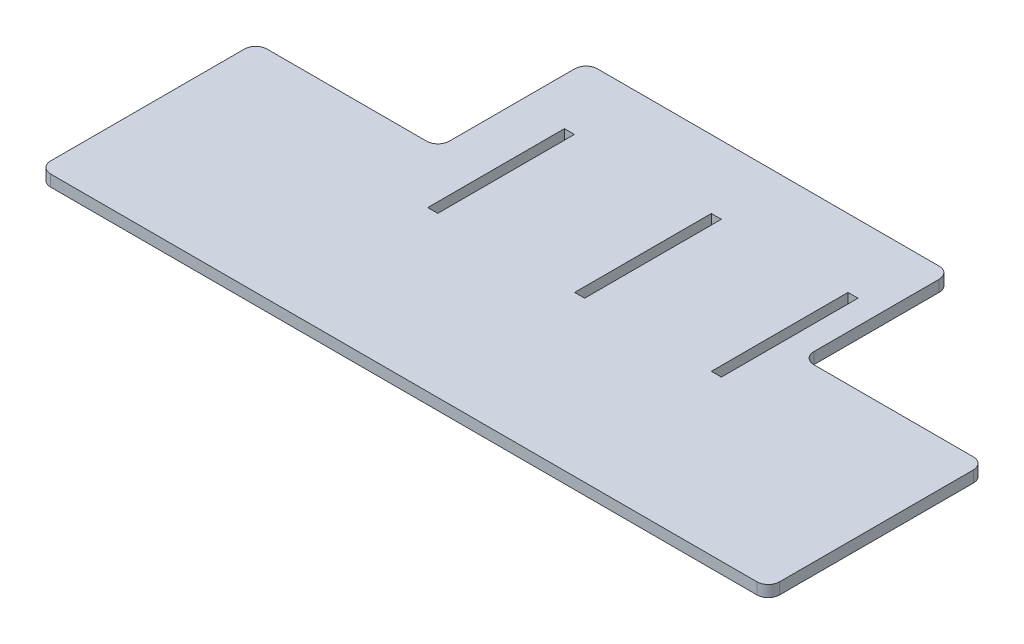
ISO-10303-21;
HEADER;
FILE_DESCRIPTION(('STEP AP214'),'2;1');
FILE_NAME('part.step','',(''),(''),'','','');
FILE_SCHEMA(('AUTOMOTIVE_DESIGN { 1 0 10303 214 1 1 1 1 }'));
ENDSEC;
DATA;
#1=APPLICATION_CONTEXT('core data for automotive mechanical design processes');
#2=APPLICATION_PROTOCOL_DEFINITION('international standard','automotive_design',2000,#1);
#3=PRODUCT_CONTEXT('',#1,'mechanical');
#4=PRODUCT('Part','Part','',(#3));
#5=PRODUCT_RELATED_PRODUCT_CATEGORY('part','',(#4));
#6=PRODUCT_DEFINITION_FORMATION('','',#4);
#7=PRODUCT_DEFINITION_CONTEXT('part definition',#1,'design');
#8=PRODUCT_DEFINITION('design','',#6,#7);
#9=PRODUCT_DEFINITION_SHAPE('','',#8);
#10=(LENGTH_UNIT() NAMED_UNIT(*) SI_UNIT(.MILLI.,.METRE.));
#11=(NAMED_UNIT(*) PLANE_ANGLE_UNIT() SI_UNIT($,.RADIAN.));
#12=(NAMED_UNIT(*) SI_UNIT($,.STERADIAN.) SOLID_ANGLE_UNIT());
#13=UNCERTAINTY_MEASURE_WITH_UNIT(LENGTH_MEASURE(1.E-05),#10,'distance_accuracy_value','');
#14=(GEOMETRIC_REPRESENTATION_CONTEXT(3) GLOBAL_UNCERTAINTY_ASSIGNED_CONTEXT((#13)) GLOBAL_UNIT_ASSIGNED_CONTEXT((#10,
#11,#12)) REPRESENTATION_CONTEXT('',''));
#15=CARTESIAN_POINT('',(0.,0.,0.));
#16=DIRECTION('',(0.,0.,1.));
#17=DIRECTION('',(1.,0.,0.));
#18=AXIS2_PLACEMENT_3D('',#15,#16,#17);
#19=CARTESIAN_POINT('',(101.6,3.175,30.1625));
#20=DIRECTION('',(-1.,0.,0.));
#21=DIRECTION('',(0.,0.,1.));
#22=AXIS2_PLACEMENT_3D('',#19,#20,#21);
#23=PLANE('',#22);
#24=DIRECTION('',(0.,0.,-1.));
#25=VECTOR('',#24,1.);
#26=CARTESIAN_POINT('',(101.6,3.175,30.1625));
#27=LINE('',#26,#25);
#28=CARTESIAN_POINT('',(101.6,3.175,26.9875));
#29=VERTEX_POINT('',#28);
#30=CARTESIAN_POINT('',(101.6,3.175,-26.9875));
#31=VERTEX_POINT('',#30);
#32=EDGE_CURVE('E306',#29,#31,#27,.T.);
#33=ORIENTED_EDGE('',*,*,#32,.F.);
#34=DIRECTION('',(0.,-1.,0.));
#35=VECTOR('',#34,1.);
#36=CARTESIAN_POINT('',(101.6,3.175,26.9875));
#37=LINE('',#36,#35);
#38=CARTESIAN_POINT('',(101.6,0.,26.9875));
#39=VERTEX_POINT('',#38);
#40=EDGE_CURVE('E404',#29,#39,#37,.T.);
#41=ORIENTED_EDGE('',*,*,#40,.T.);
#42=DIRECTION('',(0.,0.,-1.));
#43=VECTOR('',#42,1.);
#44=CARTESIAN_POINT('',(101.6,0.,30.1625));
#45=LINE('',#44,#43);
#46=CARTESIAN_POINT('',(101.6,0.,-26.9875));
#47=VERTEX_POINT('',#46);
#48=EDGE_CURVE('E299',#39,#47,#45,.T.);
#49=ORIENTED_EDGE('',*,*,#48,.T.);
#50=DIRECTION('',(0.,-1.,0.));
#51=VECTOR('',#50,1.);
#52=CARTESIAN_POINT('',(101.6,3.175,-26.9875));
#53=LINE('',#52,#51);
#54=EDGE_CURVE('E402',#47,#31,#53,.F.);
#55=ORIENTED_EDGE('',*,*,#54,.T.);
#56=EDGE_LOOP('',(#33,#41,#49,#55));
#57=FACE_BOUND('',#56,.T.);
#58=ADVANCED_FACE('F33',(#57),#23,.F.);
#59=CARTESIAN_POINT('',(50.8,3.175,-30.1625));
#60=DIRECTION('',(0.,0.,1.));
#61=DIRECTION('',(1.,0.,0.));
#62=AXIS2_PLACEMENT_3D('',#59,#60,#61);
#63=PLANE('',#62);
#64=DIRECTION('',(-1.,0.,0.));
#65=VECTOR('',#64,1.);
#66=CARTESIAN_POINT('',(50.8,3.175,-30.1625));
#67=LINE('',#66,#65);
#68=CARTESIAN_POINT('',(98.425,3.175,-30.1625));
#69=VERTEX_POINT('',#68);
#70=CARTESIAN_POINT('',(53.975,3.175,-30.1625));
#71=VERTEX_POINT('',#70);
#72=EDGE_CURVE('E309',#69,#71,#67,.T.);
#73=ORIENTED_EDGE('',*,*,#72,.F.);
#74=DIRECTION('',(0.,-1.,0.));
#75=VECTOR('',#74,1.);
#76=CARTESIAN_POINT('',(98.425,3.175,-30.1625));
#77=LINE('',#76,#75);
#78=CARTESIAN_POINT('',(98.425,0.,-30.1625));
#79=VERTEX_POINT('',#78);
#80=EDGE_CURVE('E409',#69,#79,#77,.T.);
#81=ORIENTED_EDGE('',*,*,#80,.T.);
#82=DIRECTION('',(-1.,0.,0.));
#83=VECTOR('',#82,1.);
#84=CARTESIAN_POINT('',(50.8,0.,-30.1625));
#85=LINE('',#84,#83);
#86=CARTESIAN_POINT('',(53.975,0.,-30.1625));
#87=VERTEX_POINT('',#86);
#88=EDGE_CURVE('E334',#79,#87,#85,.T.);
#89=ORIENTED_EDGE('',*,*,#88,.T.);
#90=DIRECTION('',(0.,-1.,0.));
#91=VECTOR('',#90,1.);
#92=CARTESIAN_POINT('',(53.975,3.175,-30.1625));
#93=LINE('',#92,#91);
#94=EDGE_CURVE('E407',#87,#71,#93,.F.);
#95=ORIENTED_EDGE('',*,*,#94,.T.);
#96=EDGE_LOOP('',(#73,#81,#89,#95));
#97=FACE_BOUND('',#96,.T.);
#98=ADVANCED_FACE('F517',(#97),#63,.F.);
#99=CARTESIAN_POINT('',(50.8,3.175,-30.1625));
#100=DIRECTION('',(-1.,0.,0.));
#101=DIRECTION('',(0.,0.,1.));
#102=AXIS2_PLACEMENT_3D('',#99,#100,#101);
#103=PLANE('',#102);
#104=DIRECTION('',(0.,0.,-1.));
#105=VECTOR('',#104,1.);
#106=CARTESIAN_POINT('',(50.8,3.175,-30.1625));
#107=LINE('',#106,#105);
#108=CARTESIAN_POINT('',(50.8,3.175,-33.3375));
#109=VERTEX_POINT('',#108);
#110=CARTESIAN_POINT('',(50.8,3.175,-68.2625));
#111=VERTEX_POINT('',#110);
#112=EDGE_CURVE('E313',#109,#111,#107,.T.);
#113=ORIENTED_EDGE('',*,*,#112,.F.);
#114=DIRECTION('',(0.,-1.,0.));
#115=VECTOR('',#114,1.);
#116=CARTESIAN_POINT('',(50.8,0.,-33.3375));
#117=LINE('',#116,#115);
#118=CARTESIAN_POINT('',(50.8,0.,-33.3375));
#119=VERTEX_POINT('',#118);
#120=EDGE_CURVE('E414',#109,#119,#117,.T.);
#121=ORIENTED_EDGE('',*,*,#120,.T.);
#122=DIRECTION('',(0.,0.,-1.));
#123=VECTOR('',#122,1.);
#124=CARTESIAN_POINT('',(50.8,0.,-30.1625));
#125=LINE('',#124,#123);
#126=CARTESIAN_POINT('',(50.8,0.,-68.2625));
#127=VERTEX_POINT('',#126);
#128=EDGE_CURVE('E337',#119,#127,#125,.T.);
#129=ORIENTED_EDGE('',*,*,#128,.T.);
#130=DIRECTION('',(0.,-1.,0.));
#131=VECTOR('',#130,1.);
#132=CARTESIAN_POINT('',(50.8,3.175,-68.2625));
#133=LINE('',#132,#131);
#134=EDGE_CURVE('E412',#127,#111,#133,.F.);
#135=ORIENTED_EDGE('',*,*,#134,.T.);
#136=EDGE_LOOP('',(#113,#121,#129,#135));
#137=FACE_BOUND('',#136,.T.);
#138=ADVANCED_FACE('F526',(#137),#103,.F.);
#139=CARTESIAN_POINT('',(-50.8,3.175,-71.4375));
#140=DIRECTION('',(0.,0.,1.));
#141=DIRECTION('',(1.,0.,0.));
#142=AXIS2_PLACEMENT_3D('',#139,#140,#141);
#143=PLANE('',#142);
#144=DIRECTION('',(-1.,0.,0.));
#145=VECTOR('',#144,1.);
#146=CARTESIAN_POINT('',(-50.8,0.,-71.4375));
#147=LINE('',#146,#145);
#148=CARTESIAN_POINT('',(47.625,0.,-71.4375));
#149=VERTEX_POINT('',#148);
#150=CARTESIAN_POINT('',(-47.625,0.,-71.4375));
#151=VERTEX_POINT('',#150);
#152=EDGE_CURVE('E340',#149,#151,#147,.T.);
#153=ORIENTED_EDGE('',*,*,#152,.T.);
#154=DIRECTION('',(0.,-1.,0.));
#155=VECTOR('',#154,1.);
#156=CARTESIAN_POINT('',(-47.625,3.175,-71.4375));
#157=LINE('',#156,#155);
#158=CARTESIAN_POINT('',(-47.625,3.175,-71.4375));
#159=VERTEX_POINT('',#158);
#160=EDGE_CURVE('E373',#151,#159,#157,.F.);
#161=ORIENTED_EDGE('',*,*,#160,.T.);
#162=DIRECTION('',(-1.,0.,0.));
#163=VECTOR('',#162,1.);
#164=CARTESIAN_POINT('',(-50.8,3.175,-71.4375));
#165=LINE('',#164,#163);
#166=CARTESIAN_POINT('',(47.625,3.175,-71.4375));
#167=VERTEX_POINT('',#166);
#168=EDGE_CURVE('E316',#167,#159,#165,.T.);
#169=ORIENTED_EDGE('',*,*,#168,.F.);
#170=DIRECTION('',(0.,-1.,0.));
#171=VECTOR('',#170,1.);
#172=CARTESIAN_POINT('',(47.625,3.175,-71.4375));
#173=LINE('',#172,#171);
#174=EDGE_CURVE('E370',#167,#149,#173,.T.);
#175=ORIENTED_EDGE('',*,*,#174,.T.);
#176=EDGE_LOOP('',(#153,#161,#169,#175));
#177=FACE_BOUND('',#176,.T.);
#178=ADVANCED_FACE('F529',(#177),#143,.F.);
#179=CARTESIAN_POINT('',(-50.8,3.175,-30.1625));
#180=DIRECTION('',(1.,0.,0.));
#181=DIRECTION('',(0.,0.,-1.));
#182=AXIS2_PLACEMENT_3D('',#179,#180,#181);
#183=PLANE('',#182);
#184=DIRECTION('',(0.,0.,1.));
#185=VECTOR('',#184,1.);
#186=CARTESIAN_POINT('',(-50.8,3.175,-30.1625));
#187=LINE('',#186,#185);
#188=CARTESIAN_POINT('',(-50.8,3.175,-68.2625));
#189=VERTEX_POINT('',#188);
#190=CARTESIAN_POINT('',(-50.8,3.175,-33.3375));
#191=VERTEX_POINT('',#190);
#192=EDGE_CURVE('E319',#189,#191,#187,.T.);
#193=ORIENTED_EDGE('',*,*,#192,.F.);
#194=DIRECTION('',(0.,-1.,0.));
#195=VECTOR('',#194,1.);
#196=CARTESIAN_POINT('',(-50.8,3.175,-68.2625));
#197=LINE('',#196,#195);
#198=CARTESIAN_POINT('',(-50.8,0.,-68.2625));
#199=VERTEX_POINT('',#198);
#200=EDGE_CURVE('E355',#189,#199,#197,.T.);
#201=ORIENTED_EDGE('',*,*,#200,.T.);
#202=DIRECTION('',(0.,0.,1.));
#203=VECTOR('',#202,1.);
#204=CARTESIAN_POINT('',(-50.8,0.,-30.1625));
#205=LINE('',#204,#203);
#206=CARTESIAN_POINT('',(-50.8,0.,-33.3375));
#207=VERTEX_POINT('',#206);
#208=EDGE_CURVE('E343',#199,#207,#205,.T.);
#209=ORIENTED_EDGE('',*,*,#208,.T.);
#210=DIRECTION('',(0.,-1.,0.));
#211=VECTOR('',#210,1.);
#212=CARTESIAN_POINT('',(-50.8,3.175,-33.3375));
#213=LINE('',#212,#211);
#214=EDGE_CURVE('E331',#207,#191,#213,.F.);
#215=ORIENTED_EDGE('',*,*,#214,.T.);
#216=EDGE_LOOP('',(#193,#201,#209,#215));
#217=FACE_BOUND('',#216,.T.);
#218=ADVANCED_FACE('F472',(#217),#183,.F.);
#219=CARTESIAN_POINT('',(-101.6,3.175,-30.1625));
#220=DIRECTION('',(0.,0.,1.));
#221=DIRECTION('',(1.,0.,0.));
#222=AXIS2_PLACEMENT_3D('',#219,#220,#221);
#223=PLANE('',#222);
#224=DIRECTION('',(-1.,0.,0.));
#225=VECTOR('',#224,1.);
#226=CARTESIAN_POINT('',(-101.6,3.175,-30.1625));
#227=LINE('',#226,#225);
#228=CARTESIAN_POINT('',(-53.975,3.175,-30.1625));
#229=VERTEX_POINT('',#228);
#230=CARTESIAN_POINT('',(-98.425,3.175,-30.1625));
#231=VERTEX_POINT('',#230);
#232=EDGE_CURVE('E322',#229,#231,#227,.T.);
#233=ORIENTED_EDGE('',*,*,#232,.F.);
#234=DIRECTION('',(0.,-1.,0.));
#235=VECTOR('',#234,1.);
#236=CARTESIAN_POINT('',(-53.975,0.,-30.1625));
#237=LINE('',#236,#235);
#238=CARTESIAN_POINT('',(-53.975,0.,-30.1625));
#239=VERTEX_POINT('',#238);
#240=EDGE_CURVE('E389',#229,#239,#237,.T.);
#241=ORIENTED_EDGE('',*,*,#240,.T.);
#242=DIRECTION('',(-1.,0.,0.));
#243=VECTOR('',#242,1.);
#244=CARTESIAN_POINT('',(-101.6,0.,-30.1625));
#245=LINE('',#244,#243);
#246=CARTESIAN_POINT('',(-98.425,0.,-30.1625));
#247=VERTEX_POINT('',#246);
#248=EDGE_CURVE('E346',#239,#247,#245,.T.);
#249=ORIENTED_EDGE('',*,*,#248,.T.);
#250=DIRECTION('',(0.,-1.,0.));
#251=VECTOR('',#250,1.);
#252=CARTESIAN_POINT('',(-98.425,3.175,-30.1625));
#253=LINE('',#252,#251);
#254=EDGE_CURVE('E387',#247,#231,#253,.F.);
#255=ORIENTED_EDGE('',*,*,#254,.T.);
#256=EDGE_LOOP('',(#233,#241,#249,#255));
#257=FACE_BOUND('',#256,.T.);
#258=ADVANCED_FACE('F483',(#257),#223,.F.);
#259=CARTESIAN_POINT('',(-101.6,3.175,30.1625));
#260=DIRECTION('',(1.,0.,0.));
#261=DIRECTION('',(0.,0.,-1.));
#262=AXIS2_PLACEMENT_3D('',#259,#260,#261);
#263=PLANE('',#262);
#264=DIRECTION('',(0.,0.,1.));
#265=VECTOR('',#264,1.);
#266=CARTESIAN_POINT('',(-101.6,3.175,30.1625));
#267=LINE('',#266,#265);
#268=CARTESIAN_POINT('',(-101.6,3.175,-26.9875));
#269=VERTEX_POINT('',#268);
#270=CARTESIAN_POINT('',(-101.6,3.175,26.9875));
#271=VERTEX_POINT('',#270);
#272=EDGE_CURVE('E325',#269,#271,#267,.T.);
#273=ORIENTED_EDGE('',*,*,#272,.F.);
#274=DIRECTION('',(0.,-1.,0.));
#275=VECTOR('',#274,1.);
#276=CARTESIAN_POINT('',(-101.6,3.175,-26.9875));
#277=LINE('',#276,#275);
#278=CARTESIAN_POINT('',(-101.6,0.,-26.9875));
#279=VERTEX_POINT('',#278);
#280=EDGE_CURVE('E394',#269,#279,#277,.T.);
#281=ORIENTED_EDGE('',*,*,#280,.T.);
#282=DIRECTION('',(0.,0.,1.));
#283=VECTOR('',#282,1.);
#284=CARTESIAN_POINT('',(-101.6,0.,30.1625));
#285=LINE('',#284,#283);
#286=CARTESIAN_POINT('',(-101.6,0.,26.9875));
#287=VERTEX_POINT('',#286);
#288=EDGE_CURVE('E349',#279,#287,#285,.T.);
#289=ORIENTED_EDGE('',*,*,#288,.T.);
#290=DIRECTION('',(0.,-1.,0.));
#291=VECTOR('',#290,1.);
#292=CARTESIAN_POINT('',(-101.6,3.175,26.9875));
#293=LINE('',#292,#291);
#294=EDGE_CURVE('E392',#287,#271,#293,.F.);
#295=ORIENTED_EDGE('',*,*,#294,.T.);
#296=EDGE_LOOP('',(#273,#281,#289,#295));
#297=FACE_BOUND('',#296,.T.);
#298=ADVANCED_FACE('F492',(#297),#263,.F.);
#299=CARTESIAN_POINT('',(-101.6,3.175,30.1625));
#300=DIRECTION('',(0.,0.,-1.));
#301=DIRECTION('',(-1.,0.,0.));
#302=AXIS2_PLACEMENT_3D('',#299,#300,#301);
#303=PLANE('',#302);
#304=DIRECTION('',(1.,0.,0.));
#305=VECTOR('',#304,1.);
#306=CARTESIAN_POINT('',(-101.6,3.175,30.1625));
#307=LINE('',#306,#305);
#308=CARTESIAN_POINT('',(-98.425,3.175,30.1625));
#309=VERTEX_POINT('',#308);
#310=CARTESIAN_POINT('',(98.425,3.175,30.1625));
#311=VERTEX_POINT('',#310);
#312=EDGE_CURVE('E328',#309,#311,#307,.T.);
#313=ORIENTED_EDGE('',*,*,#312,.F.);
#314=DIRECTION('',(0.,-1.,0.));
#315=VECTOR('',#314,1.);
#316=CARTESIAN_POINT('',(-98.425,3.175,30.1625));
#317=LINE('',#316,#315);
#318=CARTESIAN_POINT('',(-98.425,0.,30.1625));
#319=VERTEX_POINT('',#318);
#320=EDGE_CURVE('E399',#309,#319,#317,.T.);
#321=ORIENTED_EDGE('',*,*,#320,.T.);
#322=DIRECTION('',(1.,0.,0.));
#323=VECTOR('',#322,1.);
#324=CARTESIAN_POINT('',(-101.6,0.,30.1625));
#325=LINE('',#324,#323);
#326=CARTESIAN_POINT('',(98.425,0.,30.1625));
#327=VERTEX_POINT('',#326);
#328=EDGE_CURVE('E310',#319,#327,#325,.T.);
#329=ORIENTED_EDGE('',*,*,#328,.T.);
#330=DIRECTION('',(0.,-1.,0.));
#331=VECTOR('',#330,1.);
#332=CARTESIAN_POINT('',(98.425,3.175,30.1625));
#333=LINE('',#332,#331);
#334=EDGE_CURVE('E397',#327,#311,#333,.F.);
#335=ORIENTED_EDGE('',*,*,#334,.T.);
#336=EDGE_LOOP('',(#313,#321,#329,#335));
#337=FACE_BOUND('',#336,.T.);
#338=ADVANCED_FACE('F453',(#337),#303,.F.);
#339=CARTESIAN_POINT('',(0.,3.175,0.));
#340=DIRECTION('',(0.,-1.,0.));
#341=DIRECTION('',(0.,0.,-1.));
#342=AXIS2_PLACEMENT_3D('',#339,#340,#341);
#343=PLANE('',#342);
#344=DIRECTION('',(-1.,0.,0.));
#345=VECTOR('',#344,1.);
#346=CARTESIAN_POINT('',(44.069,3.175,-52.3875));
#347=LINE('',#346,#345);
#348=CARTESIAN_POINT('',(44.069,3.175,-52.3875));
#349=VERTEX_POINT('',#348);
#350=CARTESIAN_POINT('',(41.275,3.175,-52.3875));
#351=VERTEX_POINT('',#350);
#352=EDGE_CURVE('E244',#349,#351,#347,.T.);
#353=ORIENTED_EDGE('',*,*,#352,.F.);
#354=DIRECTION('',(0.,0.,-1.));
#355=VECTOR('',#354,1.);
#356=CARTESIAN_POINT('',(44.069,3.175,-52.3875));
#357=LINE('',#356,#355);
#358=CARTESIAN_POINT('',(44.069,3.175,-14.2875));
#359=VERTEX_POINT('',#358);
#360=EDGE_CURVE('E48',#359,#349,#357,.T.);
#361=ORIENTED_EDGE('',*,*,#360,.F.);
#362=DIRECTION('',(1.,0.,0.));
#363=VECTOR('',#362,1.);
#364=CARTESIAN_POINT('',(44.069,3.175,-14.2875));
#365=LINE('',#364,#363);
#366=CARTESIAN_POINT('',(41.275,3.175,-14.2875));
#367=VERTEX_POINT('',#366);
#368=EDGE_CURVE('E235',#367,#359,#365,.T.);
#369=ORIENTED_EDGE('',*,*,#368,.F.);
#370=DIRECTION('',(0.,0.,1.));
#371=VECTOR('',#370,1.);
#372=CARTESIAN_POINT('',(41.275,3.175,-52.3875));
#373=LINE('',#372,#371);
#374=EDGE_CURVE('E238',#351,#367,#373,.T.);
#375=ORIENTED_EDGE('',*,*,#374,.F.);
#376=EDGE_LOOP('',(#353,#361,#369,#375));
#377=FACE_BOUND('',#376,.T.);
#378=DIRECTION('',(1.,0.,0.));
#379=VECTOR('',#378,1.);
#380=CARTESIAN_POINT('',(-37.7825,3.175,-14.2875));
#381=LINE('',#380,#379);
#382=CARTESIAN_POINT('',(-37.7825,3.175,-14.2875));
#383=VERTEX_POINT('',#382);
#384=CARTESIAN_POINT('',(-34.9885,3.175,-14.2875));
#385=VERTEX_POINT('',#384);
#386=EDGE_CURVE('E255',#383,#385,#381,.T.);
#387=ORIENTED_EDGE('',*,*,#386,.F.);
#388=DIRECTION('',(0.,0.,1.));
#389=VECTOR('',#388,1.);
#390=CARTESIAN_POINT('',(-37.7825,3.175,-14.2875));
#391=LINE('',#390,#389);
#392=CARTESIAN_POINT('',(-37.7825,3.175,-52.3875));
#393=VERTEX_POINT('',#392);
#394=EDGE_CURVE('E250',#393,#383,#391,.T.);
#395=ORIENTED_EDGE('',*,*,#394,.F.);
#396=DIRECTION('',(-1.,0.,0.));
#397=VECTOR('',#396,1.);
#398=CARTESIAN_POINT('',(-37.7825,3.175,-52.3875));
#399=LINE('',#398,#397);
#400=CARTESIAN_POINT('',(-34.9885,3.175,-52.3875));
#401=VERTEX_POINT('',#400);
#402=EDGE_CURVE('E261',#401,#393,#399,.T.);
#403=ORIENTED_EDGE('',*,*,#402,.F.);
#404=DIRECTION('',(0.,0.,-1.));
#405=VECTOR('',#404,1.);
#406=CARTESIAN_POINT('',(-34.9885,3.175,-14.2875));
#407=LINE('',#406,#405);
#408=EDGE_CURVE('E258',#385,#401,#407,.T.);
#409=ORIENTED_EDGE('',*,*,#408,.F.);
#410=EDGE_LOOP('',(#387,#395,#403,#409));
#411=FACE_BOUND('',#410,.T.);
#412=DIRECTION('',(1.,0.,0.));
#413=VECTOR('',#412,1.);
#414=CARTESIAN_POINT('',(3.17499999999999,3.175,-14.2875));
#415=LINE('',#414,#413);
#416=CARTESIAN_POINT('',(3.17499999999999,3.175,-14.2875));
#417=VERTEX_POINT('',#416);
#418=CARTESIAN_POINT('',(5.96899999999999,3.175,-14.2875));
#419=VERTEX_POINT('',#418);
#420=EDGE_CURVE('E289',#417,#419,#415,.T.);
#421=ORIENTED_EDGE('',*,*,#420,.F.);
#422=DIRECTION('',(0.,0.,1.));
#423=VECTOR('',#422,1.);
#424=CARTESIAN_POINT('',(3.17499999999998,3.175,-52.3875));
#425=LINE('',#424,#423);
#426=CARTESIAN_POINT('',(3.17499999999998,3.175,-52.3875));
#427=VERTEX_POINT('',#426);
#428=EDGE_CURVE('E267',#427,#417,#425,.T.);
#429=ORIENTED_EDGE('',*,*,#428,.F.);
#430=DIRECTION('',(-1.,0.,0.));
#431=VECTOR('',#430,1.);
#432=CARTESIAN_POINT('',(3.17499999999998,3.175,-52.3875));
#433=LINE('',#432,#431);
#434=CARTESIAN_POINT('',(5.96899999999998,3.175,-52.3875));
#435=VERTEX_POINT('',#434);
#436=EDGE_CURVE('E278',#435,#427,#433,.T.);
#437=ORIENTED_EDGE('',*,*,#436,.F.);
#438=DIRECTION('',(0.,0.,-1.));
#439=VECTOR('',#438,1.);
#440=CARTESIAN_POINT('',(5.96899999999998,3.175,-52.3875));
#441=LINE('',#440,#439);
#442=EDGE_CURVE('E292',#419,#435,#441,.T.);
#443=ORIENTED_EDGE('',*,*,#442,.F.);
#444=EDGE_LOOP('',(#421,#429,#437,#443));
#445=FACE_BOUND('',#444,.T.);
#446=ORIENTED_EDGE('',*,*,#168,.T.);
#447=CARTESIAN_POINT('',(-47.625,3.175,-68.2625));
#448=DIRECTION('',(0.,-1.,0.));
#449=DIRECTION('',(0.,0.,-1.));
#450=AXIS2_PLACEMENT_3D('',#447,#448,#449);
#451=CIRCLE('',#450,3.175);
#452=EDGE_CURVE('E385',#159,#189,#451,.F.);
#453=ORIENTED_EDGE('',*,*,#452,.T.);
#454=ORIENTED_EDGE('',*,*,#192,.T.);
#455=CARTESIAN_POINT('',(-53.975,3.175,-33.3375));
#456=DIRECTION('',(0.,-1.,0.));
#457=DIRECTION('',(0.,0.,-1.));
#458=AXIS2_PLACEMENT_3D('',#455,#456,#457);
#459=CIRCLE('',#458,3.175);
#460=EDGE_CURVE('E419',#191,#229,#459,.T.);
#461=ORIENTED_EDGE('',*,*,#460,.T.);
#462=ORIENTED_EDGE('',*,*,#232,.T.);
#463=CARTESIAN_POINT('',(-98.425,3.175,-26.9875));
#464=DIRECTION('',(0.,-1.,0.));
#465=DIRECTION('',(0.,0.,-1.));
#466=AXIS2_PLACEMENT_3D('',#463,#464,#465);
#467=CIRCLE('',#466,3.175);
#468=EDGE_CURVE('E383',#231,#269,#467,.F.);
#469=ORIENTED_EDGE('',*,*,#468,.T.);
#470=ORIENTED_EDGE('',*,*,#272,.T.);
#471=CARTESIAN_POINT('',(-98.425,3.175,26.9875));
#472=DIRECTION('',(0.,-1.,0.));
#473=DIRECTION('',(0.,0.,-1.));
#474=AXIS2_PLACEMENT_3D('',#471,#472,#473);
#475=CIRCLE('',#474,3.175);
#476=EDGE_CURVE('E381',#271,#309,#475,.F.);
#477=ORIENTED_EDGE('',*,*,#476,.T.);
#478=ORIENTED_EDGE('',*,*,#312,.T.);
#479=CARTESIAN_POINT('',(98.425,3.175,26.9875));
#480=DIRECTION('',(0.,-1.,0.));
#481=DIRECTION('',(0.,0.,-1.));
#482=AXIS2_PLACEMENT_3D('',#479,#480,#481);
#483=CIRCLE('',#482,3.175);
#484=EDGE_CURVE('E379',#311,#29,#483,.F.);
#485=ORIENTED_EDGE('',*,*,#484,.T.);
#486=ORIENTED_EDGE('',*,*,#32,.T.);
#487=CARTESIAN_POINT('',(98.425,3.175,-26.9875));
#488=DIRECTION('',(0.,-1.,0.));
#489=DIRECTION('',(0.,0.,-1.));
#490=AXIS2_PLACEMENT_3D('',#487,#488,#489);
#491=CIRCLE('',#490,3.175);
#492=EDGE_CURVE('E377',#31,#69,#491,.F.);
#493=ORIENTED_EDGE('',*,*,#492,.T.);
#494=ORIENTED_EDGE('',*,*,#72,.T.);
#495=CARTESIAN_POINT('',(53.975,3.175,-33.3375));
#496=DIRECTION('',(0.,-1.,0.));
#497=DIRECTION('',(0.,0.,-1.));
#498=AXIS2_PLACEMENT_3D('',#495,#496,#497);
#499=CIRCLE('',#498,3.175);
#500=EDGE_CURVE('E423',#71,#109,#499,.T.);
#501=ORIENTED_EDGE('',*,*,#500,.T.);
#502=ORIENTED_EDGE('',*,*,#112,.T.);
#503=CARTESIAN_POINT('',(47.625,3.175,-68.2625));
#504=DIRECTION('',(0.,-1.,0.));
#505=DIRECTION('',(0.,0.,-1.));
#506=AXIS2_PLACEMENT_3D('',#503,#504,#505);
#507=CIRCLE('',#506,3.175);
#508=EDGE_CURVE('E375',#111,#167,#507,.F.);
#509=ORIENTED_EDGE('',*,*,#508,.T.);
#510=EDGE_LOOP('',(#446,#453,#454,#461,#462,#469,#470,#477,#478,#485,#486,#493,#494,#501,#502,#509));
#511=FACE_BOUND('',#510,.T.);
#512=ADVANCED_FACE('F450',(#377,#411,#445,#511),#343,.F.);
#513=CARTESIAN_POINT('',(0.,0.,0.));
#514=DIRECTION('',(0.,-1.,0.));
#515=DIRECTION('',(0.,0.,-1.));
#516=AXIS2_PLACEMENT_3D('',#513,#514,#515);
#517=PLANE('',#516);
#518=DIRECTION('',(0.,0.,-1.));
#519=VECTOR('',#518,1.);
#520=CARTESIAN_POINT('',(44.069,0.,-52.3875));
#521=LINE('',#520,#519);
#522=CARTESIAN_POINT('',(44.069,0.,-14.2875));
#523=VERTEX_POINT('',#522);
#524=CARTESIAN_POINT('',(44.069,0.,-52.3875));
#525=VERTEX_POINT('',#524);
#526=EDGE_CURVE('E219',#523,#525,#521,.T.);
#527=ORIENTED_EDGE('',*,*,#526,.T.);
#528=DIRECTION('',(-1.,0.,0.));
#529=VECTOR('',#528,1.);
#530=CARTESIAN_POINT('',(44.069,0.,-52.3875));
#531=LINE('',#530,#529);
#532=CARTESIAN_POINT('',(41.275,0.,-52.3875));
#533=VERTEX_POINT('',#532);
#534=EDGE_CURVE('E228',#525,#533,#531,.T.);
#535=ORIENTED_EDGE('',*,*,#534,.T.);
#536=DIRECTION('',(0.,0.,1.));
#537=VECTOR('',#536,1.);
#538=CARTESIAN_POINT('',(41.275,0.,-52.3875));
#539=LINE('',#538,#537);
#540=CARTESIAN_POINT('',(41.275,0.,-14.2875));
#541=VERTEX_POINT('',#540);
#542=EDGE_CURVE('E56',#533,#541,#539,.T.);
#543=ORIENTED_EDGE('',*,*,#542,.T.);
#544=DIRECTION('',(1.,0.,0.));
#545=VECTOR('',#544,1.);
#546=CARTESIAN_POINT('',(44.069,0.,-14.2875));
#547=LINE('',#546,#545);
#548=EDGE_CURVE('E225',#541,#523,#547,.T.);
#549=ORIENTED_EDGE('',*,*,#548,.T.);
#550=EDGE_LOOP('',(#527,#535,#543,#549));
#551=FACE_BOUND('',#550,.T.);
#552=DIRECTION('',(0.,0.,-1.));
#553=VECTOR('',#552,1.);
#554=CARTESIAN_POINT('',(-37.7825,0.,0.));
#555=LINE('',#554,#553);
#556=CARTESIAN_POINT('',(-37.7825,0.,-14.2875));
#557=VERTEX_POINT('',#556);
#558=CARTESIAN_POINT('',(-37.7825,0.,-52.3875));
#559=VERTEX_POINT('',#558);
#560=EDGE_CURVE('E11',#557,#559,#555,.T.);
#561=ORIENTED_EDGE('',*,*,#560,.F.);
#562=DIRECTION('',(-1.,0.,0.));
#563=VECTOR('',#562,1.);
#564=CARTESIAN_POINT('',(0.,0.,-14.2875));
#565=LINE('',#564,#563);
#566=CARTESIAN_POINT('',(-34.9885,0.,-14.2875));
#567=VERTEX_POINT('',#566);
#568=EDGE_CURVE('E425',#567,#557,#565,.T.);
#569=ORIENTED_EDGE('',*,*,#568,.F.);
#570=DIRECTION('',(0.,0.,1.));
#571=VECTOR('',#570,1.);
#572=CARTESIAN_POINT('',(-34.9885,0.,0.));
#573=LINE('',#572,#571);
#574=CARTESIAN_POINT('',(-34.9885,0.,-52.3875));
#575=VERTEX_POINT('',#574);
#576=EDGE_CURVE('E427',#575,#567,#573,.T.);
#577=ORIENTED_EDGE('',*,*,#576,.F.);
#578=DIRECTION('',(1.,0.,0.));
#579=VECTOR('',#578,1.);
#580=CARTESIAN_POINT('',(0.,0.,-52.3875));
#581=LINE('',#580,#579);
#582=EDGE_CURVE('E41',#559,#575,#581,.T.);
#583=ORIENTED_EDGE('',*,*,#582,.F.);
#584=EDGE_LOOP('',(#561,#569,#577,#583));
#585=FACE_BOUND('',#584,.T.);
#586=DIRECTION('',(0.,0.,1.));
#587=VECTOR('',#586,1.);
#588=CARTESIAN_POINT('',(3.17499999999998,0.,-52.3875));
#589=LINE('',#588,#587);
#590=CARTESIAN_POINT('',(3.17499999999998,0.,-52.3875));
#591=VERTEX_POINT('',#590);
#592=CARTESIAN_POINT('',(3.17499999999999,0.,-14.2875));
#593=VERTEX_POINT('',#592);
#594=EDGE_CURVE('E274',#591,#593,#589,.T.);
#595=ORIENTED_EDGE('',*,*,#594,.T.);
#596=DIRECTION('',(1.,0.,0.));
#597=VECTOR('',#596,1.);
#598=CARTESIAN_POINT('',(3.17499999999999,0.,-14.2875));
#599=LINE('',#598,#597);
#600=CARTESIAN_POINT('',(5.96899999999999,0.,-14.2875));
#601=VERTEX_POINT('',#600);
#602=EDGE_CURVE('E277',#593,#601,#599,.T.);
#603=ORIENTED_EDGE('',*,*,#602,.T.);
#604=DIRECTION('',(0.,0.,-1.));
#605=VECTOR('',#604,1.);
#606=CARTESIAN_POINT('',(5.96899999999998,0.,-52.3875));
#607=LINE('',#606,#605);
#608=CARTESIAN_POINT('',(5.96899999999998,0.,-52.3875));
#609=VERTEX_POINT('',#608);
#610=EDGE_CURVE('E281',#601,#609,#607,.T.);
#611=ORIENTED_EDGE('',*,*,#610,.T.);
#612=DIRECTION('',(-1.,0.,0.));
#613=VECTOR('',#612,1.);
#614=CARTESIAN_POINT('',(3.17499999999998,0.,-52.3875));
#615=LINE('',#614,#613);
#616=EDGE_CURVE('E284',#609,#591,#615,.T.);
#617=ORIENTED_EDGE('',*,*,#616,.T.);
#618=EDGE_LOOP('',(#595,#603,#611,#617));
#619=FACE_BOUND('',#618,.T.);
#620=ORIENTED_EDGE('',*,*,#208,.F.);
#621=CARTESIAN_POINT('',(-47.625,0.,-68.2625));
#622=DIRECTION('',(0.,-1.,0.));
#623=DIRECTION('',(0.,0.,-1.));
#624=AXIS2_PLACEMENT_3D('',#621,#622,#623);
#625=CIRCLE('',#624,3.175);
#626=EDGE_CURVE('E368',#199,#151,#625,.T.);
#627=ORIENTED_EDGE('',*,*,#626,.T.);
#628=ORIENTED_EDGE('',*,*,#152,.F.);
#629=CARTESIAN_POINT('',(47.625,0.,-68.2625));
#630=DIRECTION('',(0.,-1.,0.));
#631=DIRECTION('',(0.,0.,-1.));
#632=AXIS2_PLACEMENT_3D('',#629,#630,#631);
#633=CIRCLE('',#632,3.175);
#634=EDGE_CURVE('E358',#149,#127,#633,.T.);
#635=ORIENTED_EDGE('',*,*,#634,.T.);
#636=ORIENTED_EDGE('',*,*,#128,.F.);
#637=CARTESIAN_POINT('',(53.975,0.,-33.3375));
#638=DIRECTION('',(0.,-1.,0.));
#639=DIRECTION('',(0.,0.,-1.));
#640=AXIS2_PLACEMENT_3D('',#637,#638,#639);
#641=CIRCLE('',#640,3.175);
#642=EDGE_CURVE('E421',#119,#87,#641,.F.);
#643=ORIENTED_EDGE('',*,*,#642,.T.);
#644=ORIENTED_EDGE('',*,*,#88,.F.);
#645=CARTESIAN_POINT('',(98.425,0.,-26.9875));
#646=DIRECTION('',(0.,-1.,0.));
#647=DIRECTION('',(0.,0.,-1.));
#648=AXIS2_PLACEMENT_3D('',#645,#646,#647);
#649=CIRCLE('',#648,3.175);
#650=EDGE_CURVE('E360',#79,#47,#649,.T.);
#651=ORIENTED_EDGE('',*,*,#650,.T.);
#652=ORIENTED_EDGE('',*,*,#48,.F.);
#653=CARTESIAN_POINT('',(98.425,0.,26.9875));
#654=DIRECTION('',(0.,-1.,0.));
#655=DIRECTION('',(0.,0.,-1.));
#656=AXIS2_PLACEMENT_3D('',#653,#654,#655);
#657=CIRCLE('',#656,3.175);
#658=EDGE_CURVE('E362',#39,#327,#657,.T.);
#659=ORIENTED_EDGE('',*,*,#658,.T.);
#660=ORIENTED_EDGE('',*,*,#328,.F.);
#661=CARTESIAN_POINT('',(-98.425,0.,26.9875));
#662=DIRECTION('',(0.,-1.,0.));
#663=DIRECTION('',(0.,0.,-1.));
#664=AXIS2_PLACEMENT_3D('',#661,#662,#663);
#665=CIRCLE('',#664,3.175);
#666=EDGE_CURVE('E364',#319,#287,#665,.T.);
#667=ORIENTED_EDGE('',*,*,#666,.T.);
#668=ORIENTED_EDGE('',*,*,#288,.F.);
#669=CARTESIAN_POINT('',(-98.425,0.,-26.9875));
#670=DIRECTION('',(0.,-1.,0.));
#671=DIRECTION('',(0.,0.,-1.));
#672=AXIS2_PLACEMENT_3D('',#669,#670,#671);
#673=CIRCLE('',#672,3.175);
#674=EDGE_CURVE('E366',#279,#247,#673,.T.);
#675=ORIENTED_EDGE('',*,*,#674,.T.);
#676=ORIENTED_EDGE('',*,*,#248,.F.);
#677=CARTESIAN_POINT('',(-53.975,0.,-33.3375));
#678=DIRECTION('',(0.,-1.,0.));
#679=DIRECTION('',(0.,0.,-1.));
#680=AXIS2_PLACEMENT_3D('',#677,#678,#679);
#681=CIRCLE('',#680,3.175);
#682=EDGE_CURVE('E417',#239,#207,#681,.F.);
#683=ORIENTED_EDGE('',*,*,#682,.T.);
#684=EDGE_LOOP('',(#620,#627,#628,#635,#636,#643,#644,#651,#652,#659,#660,#667,#668,#675,#676,#683));
#685=FACE_BOUND('',#684,.T.);
#686=ADVANCED_FACE('F232',(#551,#585,#619,#685),#517,.T.);
#687=CARTESIAN_POINT('',(3.17499999999998,0.,-52.3875));
#688=DIRECTION('',(-1.,0.,0.));
#689=DIRECTION('',(0.,0.,1.));
#690=AXIS2_PLACEMENT_3D('',#687,#688,#689);
#691=PLANE('',#690);
#692=ORIENTED_EDGE('',*,*,#428,.T.);
#693=DIRECTION('',(0.,1.,0.));
#694=VECTOR('',#693,1.);
#695=CARTESIAN_POINT('',(3.17499999999999,0.,-14.2875));
#696=LINE('',#695,#694);
#697=EDGE_CURVE('E287',#593,#417,#696,.T.);
#698=ORIENTED_EDGE('',*,*,#697,.F.);
#699=ORIENTED_EDGE('',*,*,#594,.F.);
#700=DIRECTION('',(0.,1.,0.));
#701=VECTOR('',#700,1.);
#702=CARTESIAN_POINT('',(3.17499999999998,0.,-52.3875));
#703=LINE('',#702,#701);
#704=EDGE_CURVE('E297',#591,#427,#703,.T.);
#705=ORIENTED_EDGE('',*,*,#704,.T.);
#706=EDGE_LOOP('',(#692,#698,#699,#705));
#707=FACE_BOUND('',#706,.T.);
#708=ADVANCED_FACE('F576',(#707),#691,.F.);
#709=CARTESIAN_POINT('',(3.17499999999998,0.,-52.3875));
#710=DIRECTION('',(0.,0.,-1.));
#711=DIRECTION('',(-1.,0.,0.));
#712=AXIS2_PLACEMENT_3D('',#709,#710,#711);
#713=PLANE('',#712);
#714=ORIENTED_EDGE('',*,*,#436,.T.);
#715=ORIENTED_EDGE('',*,*,#704,.F.);
#716=ORIENTED_EDGE('',*,*,#616,.F.);
#717=DIRECTION('',(0.,1.,0.));
#718=VECTOR('',#717,1.);
#719=CARTESIAN_POINT('',(5.96899999999998,0.,-52.3875));
#720=LINE('',#719,#718);
#721=EDGE_CURVE('E300',#609,#435,#720,.T.);
#722=ORIENTED_EDGE('',*,*,#721,.T.);
#723=EDGE_LOOP('',(#714,#715,#716,#722));
#724=FACE_BOUND('',#723,.T.);
#725=ADVANCED_FACE('F572',(#724),#713,.F.);
#726=CARTESIAN_POINT('',(5.96899999999998,0.,-52.3875));
#727=DIRECTION('',(1.,0.,0.));
#728=DIRECTION('',(0.,0.,-1.));
#729=AXIS2_PLACEMENT_3D('',#726,#727,#728);
#730=PLANE('',#729);
#731=ORIENTED_EDGE('',*,*,#442,.T.);
#732=ORIENTED_EDGE('',*,*,#721,.F.);
#733=ORIENTED_EDGE('',*,*,#610,.F.);
#734=DIRECTION('',(0.,1.,0.));
#735=VECTOR('',#734,1.);
#736=CARTESIAN_POINT('',(5.96899999999999,0.,-14.2875));
#737=LINE('',#736,#735);
#738=EDGE_CURVE('E302',#601,#419,#737,.T.);
#739=ORIENTED_EDGE('',*,*,#738,.T.);
#740=EDGE_LOOP('',(#731,#732,#733,#739));
#741=FACE_BOUND('',#740,.T.);
#742=ADVANCED_FACE('F575',(#741),#730,.F.);
#743=CARTESIAN_POINT('',(3.17499999999999,0.,-14.2875));
#744=DIRECTION('',(0.,0.,1.));
#745=DIRECTION('',(1.,0.,0.));
#746=AXIS2_PLACEMENT_3D('',#743,#744,#745);
#747=PLANE('',#746);
#748=ORIENTED_EDGE('',*,*,#420,.T.);
#749=ORIENTED_EDGE('',*,*,#738,.F.);
#750=ORIENTED_EDGE('',*,*,#602,.F.);
#751=ORIENTED_EDGE('',*,*,#697,.T.);
#752=EDGE_LOOP('',(#748,#749,#750,#751));
#753=FACE_BOUND('',#752,.T.);
#754=ADVANCED_FACE('F547',(#753),#747,.F.);
#755=CARTESIAN_POINT('',(-47.625,3.175,-68.2625));
#756=DIRECTION('',(0.,-1.,0.));
#757=DIRECTION('',(0.,0.,-1.));
#758=AXIS2_PLACEMENT_3D('',#755,#756,#757);
#759=CYLINDRICAL_SURFACE('',#758,3.175);
#760=ORIENTED_EDGE('',*,*,#452,.F.);
#761=ORIENTED_EDGE('',*,*,#160,.F.);
#762=ORIENTED_EDGE('',*,*,#626,.F.);
#763=ORIENTED_EDGE('',*,*,#200,.F.);
#764=EDGE_LOOP('',(#760,#761,#762,#763));
#765=FACE_BOUND('',#764,.T.);
#766=ADVANCED_FACE('F469',(#765),#759,.T.);
#767=CARTESIAN_POINT('',(-53.975,3.175,-33.3375));
#768=DIRECTION('',(0.,1.,0.));
#769=DIRECTION('',(0.,0.,1.));
#770=AXIS2_PLACEMENT_3D('',#767,#768,#769);
#771=CYLINDRICAL_SURFACE('',#770,3.175);
#772=ORIENTED_EDGE('',*,*,#460,.F.);
#773=ORIENTED_EDGE('',*,*,#214,.F.);
#774=ORIENTED_EDGE('',*,*,#682,.F.);
#775=ORIENTED_EDGE('',*,*,#240,.F.);
#776=EDGE_LOOP('',(#772,#773,#774,#775));
#777=FACE_BOUND('',#776,.T.);
#778=ADVANCED_FACE('F480',(#777),#771,.F.);
#779=CARTESIAN_POINT('',(-98.425,3.175,-26.9875));
#780=DIRECTION('',(0.,-1.,0.));
#781=DIRECTION('',(0.,0.,-1.));
#782=AXIS2_PLACEMENT_3D('',#779,#780,#781);
#783=CYLINDRICAL_SURFACE('',#782,3.175);
#784=ORIENTED_EDGE('',*,*,#468,.F.);
#785=ORIENTED_EDGE('',*,*,#254,.F.);
#786=ORIENTED_EDGE('',*,*,#674,.F.);
#787=ORIENTED_EDGE('',*,*,#280,.F.);
#788=EDGE_LOOP('',(#784,#785,#786,#787));
#789=FACE_BOUND('',#788,.T.);
#790=ADVANCED_FACE('F489',(#789),#783,.T.);
#791=CARTESIAN_POINT('',(-98.425,3.175,26.9875));
#792=DIRECTION('',(0.,-1.,0.));
#793=DIRECTION('',(0.,0.,-1.));
#794=AXIS2_PLACEMENT_3D('',#791,#792,#793);
#795=CYLINDRICAL_SURFACE('',#794,3.175);
#796=ORIENTED_EDGE('',*,*,#476,.F.);
#797=ORIENTED_EDGE('',*,*,#294,.F.);
#798=ORIENTED_EDGE('',*,*,#666,.F.);
#799=ORIENTED_EDGE('',*,*,#320,.F.);
#800=EDGE_LOOP('',(#796,#797,#798,#799));
#801=FACE_BOUND('',#800,.T.);
#802=ADVANCED_FACE('F498',(#801),#795,.T.);
#803=CARTESIAN_POINT('',(98.425,3.175,26.9875));
#804=DIRECTION('',(0.,-1.,0.));
#805=DIRECTION('',(0.,0.,-1.));
#806=AXIS2_PLACEMENT_3D('',#803,#804,#805);
#807=CYLINDRICAL_SURFACE('',#806,3.175);
#808=ORIENTED_EDGE('',*,*,#484,.F.);
#809=ORIENTED_EDGE('',*,*,#334,.F.);
#810=ORIENTED_EDGE('',*,*,#658,.F.);
#811=ORIENTED_EDGE('',*,*,#40,.F.);
#812=EDGE_LOOP('',(#808,#809,#810,#811));
#813=FACE_BOUND('',#812,.T.);
#814=ADVANCED_FACE('F506',(#813),#807,.T.);
#815=CARTESIAN_POINT('',(98.425,3.175,-26.9875));
#816=DIRECTION('',(0.,-1.,0.));
#817=DIRECTION('',(0.,0.,-1.));
#818=AXIS2_PLACEMENT_3D('',#815,#816,#817);
#819=CYLINDRICAL_SURFACE('',#818,3.175);
#820=ORIENTED_EDGE('',*,*,#492,.F.);
#821=ORIENTED_EDGE('',*,*,#54,.F.);
#822=ORIENTED_EDGE('',*,*,#650,.F.);
#823=ORIENTED_EDGE('',*,*,#80,.F.);
#824=EDGE_LOOP('',(#820,#821,#822,#823));
#825=FACE_BOUND('',#824,.T.);
#826=ADVANCED_FACE('F514',(#825),#819,.T.);
#827=CARTESIAN_POINT('',(53.975,3.175,-33.3375));
#828=DIRECTION('',(0.,1.,0.));
#829=DIRECTION('',(0.,0.,1.));
#830=AXIS2_PLACEMENT_3D('',#827,#828,#829);
#831=CYLINDRICAL_SURFACE('',#830,3.175);
#832=ORIENTED_EDGE('',*,*,#500,.F.);
#833=ORIENTED_EDGE('',*,*,#94,.F.);
#834=ORIENTED_EDGE('',*,*,#642,.F.);
#835=ORIENTED_EDGE('',*,*,#120,.F.);
#836=EDGE_LOOP('',(#832,#833,#834,#835));
#837=FACE_BOUND('',#836,.T.);
#838=ADVANCED_FACE('F523',(#837),#831,.F.);
#839=CARTESIAN_POINT('',(47.625,3.175,-68.2625));
#840=DIRECTION('',(0.,-1.,0.));
#841=DIRECTION('',(0.,0.,-1.));
#842=AXIS2_PLACEMENT_3D('',#839,#840,#841);
#843=CYLINDRICAL_SURFACE('',#842,3.175);
#844=ORIENTED_EDGE('',*,*,#508,.F.);
#845=ORIENTED_EDGE('',*,*,#134,.F.);
#846=ORIENTED_EDGE('',*,*,#634,.F.);
#847=ORIENTED_EDGE('',*,*,#174,.F.);
#848=EDGE_LOOP('',(#844,#845,#846,#847));
#849=FACE_BOUND('',#848,.T.);
#850=ADVANCED_FACE('F35',(#849),#843,.T.);
#851=CARTESIAN_POINT('',(-37.7825,-6.35,-14.2875));
#852=DIRECTION('',(-1.,0.,0.));
#853=DIRECTION('',(0.,0.,1.));
#854=AXIS2_PLACEMENT_3D('',#851,#852,#853);
#855=PLANE('',#854);
#856=ORIENTED_EDGE('',*,*,#560,.T.);
#857=DIRECTION('',(0.,1.,0.));
#858=VECTOR('',#857,1.);
#859=CARTESIAN_POINT('',(-37.7825,-6.35,-52.3875));
#860=LINE('',#859,#858);
#861=EDGE_CURVE('E265',#559,#393,#860,.T.);
#862=ORIENTED_EDGE('',*,*,#861,.T.);
#863=ORIENTED_EDGE('',*,*,#394,.T.);
#864=DIRECTION('',(0.,1.,0.));
#865=VECTOR('',#864,1.);
#866=CARTESIAN_POINT('',(-37.7825,-6.35,-14.2875));
#867=LINE('',#866,#865);
#868=EDGE_CURVE('E264',#557,#383,#867,.T.);
#869=ORIENTED_EDGE('',*,*,#868,.F.);
#870=EDGE_LOOP('',(#856,#862,#863,#869));
#871=FACE_BOUND('',#870,.T.);
#872=ADVANCED_FACE('F447',(#871),#855,.F.);
#873=CARTESIAN_POINT('',(-37.7825,-6.35,-52.3875));
#874=DIRECTION('',(0.,0.,-1.));
#875=DIRECTION('',(-1.,0.,0.));
#876=AXIS2_PLACEMENT_3D('',#873,#874,#875);
#877=PLANE('',#876);
#878=ORIENTED_EDGE('',*,*,#582,.T.);
#879=DIRECTION('',(0.,1.,0.));
#880=VECTOR('',#879,1.);
#881=CARTESIAN_POINT('',(-34.9885,-6.35,-52.3875));
#882=LINE('',#881,#880);
#883=EDGE_CURVE('E268',#575,#401,#882,.T.);
#884=ORIENTED_EDGE('',*,*,#883,.T.);
#885=ORIENTED_EDGE('',*,*,#402,.T.);
#886=ORIENTED_EDGE('',*,*,#861,.F.);
#887=EDGE_LOOP('',(#878,#884,#885,#886));
#888=FACE_BOUND('',#887,.T.);
#889=ADVANCED_FACE('F433',(#888),#877,.F.);
#890=CARTESIAN_POINT('',(-34.9885,-6.35,-14.2875));
#891=DIRECTION('',(1.,0.,0.));
#892=DIRECTION('',(0.,0.,-1.));
#893=AXIS2_PLACEMENT_3D('',#890,#891,#892);
#894=PLANE('',#893);
#895=ORIENTED_EDGE('',*,*,#576,.T.);
#896=DIRECTION('',(0.,1.,0.));
#897=VECTOR('',#896,1.);
#898=CARTESIAN_POINT('',(-34.9885,-6.35,-14.2875));
#899=LINE('',#898,#897);
#900=EDGE_CURVE('E270',#567,#385,#899,.T.);
#901=ORIENTED_EDGE('',*,*,#900,.T.);
#902=ORIENTED_EDGE('',*,*,#408,.T.);
#903=ORIENTED_EDGE('',*,*,#883,.F.);
#904=EDGE_LOOP('',(#895,#901,#902,#903));
#905=FACE_BOUND('',#904,.T.);
#906=ADVANCED_FACE('F437',(#905),#894,.F.);
#907=CARTESIAN_POINT('',(-37.7825,-6.35,-14.2875));
#908=DIRECTION('',(0.,0.,1.));
#909=DIRECTION('',(1.,0.,0.));
#910=AXIS2_PLACEMENT_3D('',#907,#908,#909);
#911=PLANE('',#910);
#912=ORIENTED_EDGE('',*,*,#568,.T.);
#913=ORIENTED_EDGE('',*,*,#868,.T.);
#914=ORIENTED_EDGE('',*,*,#386,.T.);
#915=ORIENTED_EDGE('',*,*,#900,.F.);
#916=EDGE_LOOP('',(#912,#913,#914,#915));
#917=FACE_BOUND('',#916,.T.);
#918=ADVANCED_FACE('F444',(#917),#911,.F.);
#919=CARTESIAN_POINT('',(44.069,0.,-52.3875));
#920=DIRECTION('',(1.,0.,0.));
#921=DIRECTION('',(0.,0.,-1.));
#922=AXIS2_PLACEMENT_3D('',#919,#920,#921);
#923=PLANE('',#922);
#924=ORIENTED_EDGE('',*,*,#360,.T.);
#925=DIRECTION('',(0.,1.,0.));
#926=VECTOR('',#925,1.);
#927=CARTESIAN_POINT('',(44.069,0.,-52.3875));
#928=LINE('',#927,#926);
#929=EDGE_CURVE('E215',#525,#349,#928,.T.);
#930=ORIENTED_EDGE('',*,*,#929,.F.);
#931=ORIENTED_EDGE('',*,*,#526,.F.);
#932=DIRECTION('',(0.,1.,0.));
#933=VECTOR('',#932,1.);
#934=CARTESIAN_POINT('',(44.069,0.,-14.2875));
#935=LINE('',#934,#933);
#936=EDGE_CURVE('E248',#523,#359,#935,.T.);
#937=ORIENTED_EDGE('',*,*,#936,.T.);
#938=EDGE_LOOP('',(#924,#930,#931,#937));
#939=FACE_BOUND('',#938,.T.);
#940=ADVANCED_FACE('F217',(#939),#923,.F.);
#941=CARTESIAN_POINT('',(44.069,0.,-14.2875));
#942=DIRECTION('',(0.,0.,1.));
#943=DIRECTION('',(1.,0.,0.));
#944=AXIS2_PLACEMENT_3D('',#941,#942,#943);
#945=PLANE('',#944);
#946=ORIENTED_EDGE('',*,*,#368,.T.);
#947=ORIENTED_EDGE('',*,*,#936,.F.);
#948=ORIENTED_EDGE('',*,*,#548,.F.);
#949=DIRECTION('',(0.,1.,0.));
#950=VECTOR('',#949,1.);
#951=CARTESIAN_POINT('',(41.275,0.,-14.2875));
#952=LINE('',#951,#950);
#953=EDGE_CURVE('E251',#541,#367,#952,.T.);
#954=ORIENTED_EDGE('',*,*,#953,.T.);
#955=EDGE_LOOP('',(#946,#947,#948,#954));
#956=FACE_BOUND('',#955,.T.);
#957=ADVANCED_FACE('F695',(#956),#945,.F.);
#958=CARTESIAN_POINT('',(41.275,0.,-52.3875));
#959=DIRECTION('',(-1.,0.,0.));
#960=DIRECTION('',(0.,0.,1.));
#961=AXIS2_PLACEMENT_3D('',#958,#959,#960);
#962=PLANE('',#961);
#963=ORIENTED_EDGE('',*,*,#374,.T.);
#964=ORIENTED_EDGE('',*,*,#953,.F.);
#965=ORIENTED_EDGE('',*,*,#542,.F.);
#966=DIRECTION('',(0.,1.,0.));
#967=VECTOR('',#966,1.);
#968=CARTESIAN_POINT('',(41.275,0.,-52.3875));
#969=LINE('',#968,#967);
#970=EDGE_CURVE('E224',#533,#351,#969,.T.);
#971=ORIENTED_EDGE('',*,*,#970,.T.);
#972=EDGE_LOOP('',(#963,#964,#965,#971));
#973=FACE_BOUND('',#972,.T.);
#974=ADVANCED_FACE('F701',(#973),#962,.F.);
#975=CARTESIAN_POINT('',(44.069,0.,-52.3875));
#976=DIRECTION('',(0.,0.,-1.));
#977=DIRECTION('',(-1.,0.,0.));
#978=AXIS2_PLACEMENT_3D('',#975,#976,#977);
#979=PLANE('',#978);
#980=ORIENTED_EDGE('',*,*,#352,.T.);
#981=ORIENTED_EDGE('',*,*,#970,.F.);
#982=ORIENTED_EDGE('',*,*,#534,.F.);
#983=ORIENTED_EDGE('',*,*,#929,.T.);
#984=EDGE_LOOP('',(#980,#981,#982,#983));
#985=FACE_BOUND('',#984,.T.);
#986=ADVANCED_FACE('F229',(#985),#979,.F.);
#987=CLOSED_SHELL('',(#58,#98,#138,#178,#218,#258,#298,#338,#512,#686,#708,#725,#742,#754,#766,
#778,#790,#802,#814,#826,#838,#850,#872,#889,#906,#918,#940,#957,#974,#986));
#988=MANIFOLD_SOLID_BREP('B2',#987);
#989=ADVANCED_BREP_SHAPE_REPRESENTATION('',(#18,#988),#14);
#990=SHAPE_DEFINITION_REPRESENTATION(#9,#989);
ENDSEC;
END-ISO-10303-21;
